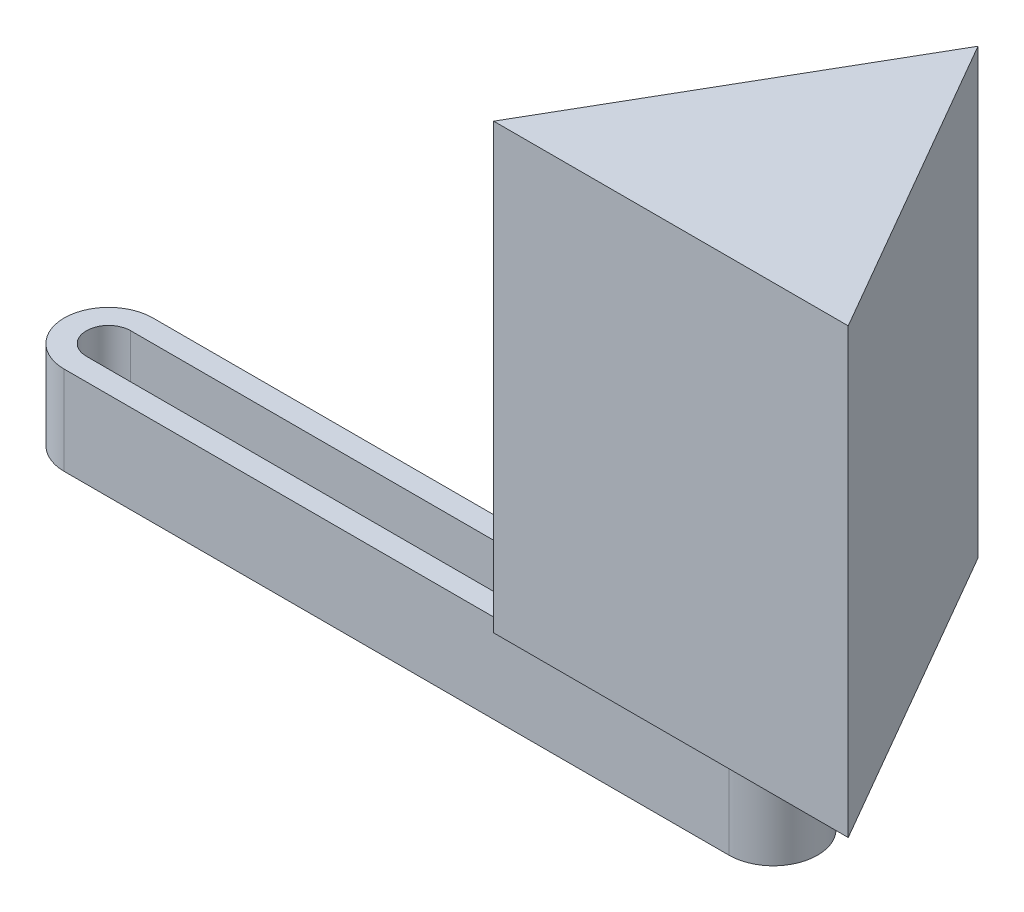
ISO-10303-21;
HEADER;
FILE_DESCRIPTION(('STEP AP214'),'2;1');
FILE_NAME('part.step','',(''),(''),'','','');
FILE_SCHEMA(('AUTOMOTIVE_DESIGN { 1 0 10303 214 1 1 1 1 }'));
ENDSEC;
DATA;
#1=APPLICATION_CONTEXT('core data for automotive mechanical design processes');
#2=APPLICATION_PROTOCOL_DEFINITION('international standard','automotive_design',2000,#1);
#3=PRODUCT_CONTEXT('',#1,'mechanical');
#4=PRODUCT('Part','Part','',(#3));
#5=PRODUCT_RELATED_PRODUCT_CATEGORY('part','',(#4));
#6=PRODUCT_DEFINITION_FORMATION('','',#4);
#7=PRODUCT_DEFINITION_CONTEXT('part definition',#1,'design');
#8=PRODUCT_DEFINITION('design','',#6,#7);
#9=PRODUCT_DEFINITION_SHAPE('','',#8);
#10=(LENGTH_UNIT() NAMED_UNIT(*) SI_UNIT(.MILLI.,.METRE.));
#11=(NAMED_UNIT(*) PLANE_ANGLE_UNIT() SI_UNIT($,.RADIAN.));
#12=(NAMED_UNIT(*) SI_UNIT($,.STERADIAN.) SOLID_ANGLE_UNIT());
#13=UNCERTAINTY_MEASURE_WITH_UNIT(LENGTH_MEASURE(1.E-05),#10,'distance_accuracy_value','');
#14=(GEOMETRIC_REPRESENTATION_CONTEXT(3) GLOBAL_UNCERTAINTY_ASSIGNED_CONTEXT((#13)) GLOBAL_UNIT_ASSIGNED_CONTEXT((#10,
#11,#12)) REPRESENTATION_CONTEXT('',''));
#15=CARTESIAN_POINT('',(0.,0.,0.));
#16=DIRECTION('',(0.,0.,1.));
#17=DIRECTION('',(1.,0.,0.));
#18=AXIS2_PLACEMENT_3D('',#15,#16,#17);
#19=CARTESIAN_POINT('',(410.,-10.,589.615242270663));
#20=DIRECTION('',(0.,1.,0.));
#21=DIRECTION('',(0.,0.,1.));
#22=AXIS2_PLACEMENT_3D('',#19,#20,#21);
#23=CYLINDRICAL_SURFACE('',#22,2.49999999999995);
#24=DIRECTION('',(0.,1.,0.));
#25=VECTOR('',#24,1.);
#26=CARTESIAN_POINT('',(410.,-10.,592.115242270663));
#27=LINE('',#26,#25);
#28=CARTESIAN_POINT('',(410.,-10.,592.115242270663));
#29=VERTEX_POINT('',#28);
#30=CARTESIAN_POINT('',(410.,-5.,592.115242270663));
#31=VERTEX_POINT('',#30);
#32=EDGE_CURVE('E273',#29,#31,#27,.T.);
#33=ORIENTED_EDGE('',*,*,#32,.T.);
#34=CARTESIAN_POINT('',(410.,-5.,589.615242270663));
#35=DIRECTION('',(0.,1.,0.));
#36=DIRECTION('',(0.,0.,1.));
#37=AXIS2_PLACEMENT_3D('',#34,#35,#36);
#38=CIRCLE('',#37,2.49999999999995);
#39=CARTESIAN_POINT('',(410.,-5.,587.115242270663));
#40=VERTEX_POINT('',#39);
#41=EDGE_CURVE('E211',#40,#31,#38,.F.);
#42=ORIENTED_EDGE('',*,*,#41,.F.);
#43=DIRECTION('',(0.,1.,0.));
#44=VECTOR('',#43,1.);
#45=CARTESIAN_POINT('',(410.,-10.,587.115242270663));
#46=LINE('',#45,#44);
#47=CARTESIAN_POINT('',(410.,-10.,587.115242270663));
#48=VERTEX_POINT('',#47);
#49=EDGE_CURVE('E274',#48,#40,#46,.T.);
#50=ORIENTED_EDGE('',*,*,#49,.F.);
#51=CARTESIAN_POINT('',(410.,-10.,589.615242270663));
#52=DIRECTION('',(0.,1.,0.));
#53=DIRECTION('',(0.,0.,1.));
#54=AXIS2_PLACEMENT_3D('',#51,#52,#53);
#55=CIRCLE('',#54,2.49999999999995);
#56=EDGE_CURVE('E231',#48,#29,#55,.F.);
#57=ORIENTED_EDGE('',*,*,#56,.T.);
#58=EDGE_LOOP('',(#33,#42,#50,#57));
#59=FACE_BOUND('',#58,.T.);
#60=ADVANCED_FACE('F35',(#59),#23,.F.);
#61=CARTESIAN_POINT('',(0.,-10.,584.615242270663));
#62=DIRECTION('',(0.,0.,-1.));
#63=DIRECTION('',(-1.,0.,0.));
#64=AXIS2_PLACEMENT_3D('',#61,#62,#63);
#65=PLANE('',#64);
#66=DIRECTION('',(-1.,0.,0.));
#67=VECTOR('',#66,1.);
#68=CARTESIAN_POINT('',(0.,0.,584.615242270663));
#69=LINE('',#68,#67);
#70=CARTESIAN_POINT('',(410.,0.,584.615242270663));
#71=VERTEX_POINT('',#70);
#72=CARTESIAN_POINT('',(335.,0.,584.615242270663));
#73=VERTEX_POINT('',#72);
#74=EDGE_CURVE('E253',#71,#73,#69,.T.);
#75=ORIENTED_EDGE('',*,*,#74,.F.);
#76=DIRECTION('',(0.,1.,0.));
#77=VECTOR('',#76,1.);
#78=CARTESIAN_POINT('',(410.,-10.,584.615242270663));
#79=LINE('',#78,#77);
#80=CARTESIAN_POINT('',(410.,-10.,584.615242270663));
#81=VERTEX_POINT('',#80);
#82=EDGE_CURVE('E11',#81,#71,#79,.T.);
#83=ORIENTED_EDGE('',*,*,#82,.F.);
#84=DIRECTION('',(-1.,0.,0.));
#85=VECTOR('',#84,1.);
#86=CARTESIAN_POINT('',(0.,-10.,584.615242270663));
#87=LINE('',#86,#85);
#88=CARTESIAN_POINT('',(335.,-10.,584.615242270663));
#89=VERTEX_POINT('',#88);
#90=EDGE_CURVE('E236',#81,#89,#87,.T.);
#91=ORIENTED_EDGE('',*,*,#90,.T.);
#92=DIRECTION('',(0.,1.,0.));
#93=VECTOR('',#92,1.);
#94=CARTESIAN_POINT('',(335.,-10.,584.615242270663));
#95=LINE('',#94,#93);
#96=EDGE_CURVE('E268',#89,#73,#95,.T.);
#97=ORIENTED_EDGE('',*,*,#96,.T.);
#98=EDGE_LOOP('',(#75,#83,#91,#97));
#99=FACE_BOUND('',#98,.T.);
#100=ADVANCED_FACE('F310',(#99),#65,.T.);
#101=CARTESIAN_POINT('',(410.,-10.,589.615242270663));
#102=DIRECTION('',(0.,1.,0.));
#103=DIRECTION('',(0.,0.,1.));
#104=AXIS2_PLACEMENT_3D('',#101,#102,#103);
#105=CYLINDRICAL_SURFACE('',#104,5.);
#106=CARTESIAN_POINT('',(410.,0.,589.615242270663));
#107=DIRECTION('',(0.,1.,0.));
#108=DIRECTION('',(0.,0.,1.));
#109=AXIS2_PLACEMENT_3D('',#106,#107,#108);
#110=CIRCLE('',#109,5.);
#111=CARTESIAN_POINT('',(410.,0.,594.615242270663));
#112=VERTEX_POINT('',#111);
#113=EDGE_CURVE('E229',#71,#112,#110,.F.);
#114=ORIENTED_EDGE('',*,*,#113,.T.);
#115=DIRECTION('',(0.,1.,0.));
#116=VECTOR('',#115,1.);
#117=CARTESIAN_POINT('',(410.,-10.,594.615242270663));
#118=LINE('',#117,#116);
#119=CARTESIAN_POINT('',(410.,-10.,594.615242270663));
#120=VERTEX_POINT('',#119);
#121=EDGE_CURVE('E44',#120,#112,#118,.T.);
#122=ORIENTED_EDGE('',*,*,#121,.F.);
#123=CARTESIAN_POINT('',(410.,-10.,589.615242270663));
#124=DIRECTION('',(0.,1.,0.));
#125=DIRECTION('',(0.,0.,1.));
#126=AXIS2_PLACEMENT_3D('',#123,#124,#125);
#127=CIRCLE('',#126,5.);
#128=EDGE_CURVE('E244',#81,#120,#127,.F.);
#129=ORIENTED_EDGE('',*,*,#128,.F.);
#130=ORIENTED_EDGE('',*,*,#82,.T.);
#131=EDGE_LOOP('',(#114,#122,#129,#130));
#132=FACE_BOUND('',#131,.T.);
#133=ADVANCED_FACE('F315',(#132),#105,.T.);
#134=CARTESIAN_POINT('',(0.,-10.,594.615242270663));
#135=DIRECTION('',(0.,0.,-1.));
#136=DIRECTION('',(-1.,0.,0.));
#137=AXIS2_PLACEMENT_3D('',#134,#135,#136);
#138=PLANE('',#137);
#139=DIRECTION('',(-1.,0.,0.));
#140=VECTOR('',#139,1.);
#141=CARTESIAN_POINT('',(0.,0.,594.615242270663));
#142=LINE('',#141,#140);
#143=CARTESIAN_POINT('',(335.,0.,594.615242270663));
#144=VERTEX_POINT('',#143);
#145=EDGE_CURVE('E259',#112,#144,#142,.T.);
#146=ORIENTED_EDGE('',*,*,#145,.T.);
#147=DIRECTION('',(0.,1.,0.));
#148=VECTOR('',#147,1.);
#149=CARTESIAN_POINT('',(335.,-10.,594.615242270663));
#150=LINE('',#149,#148);
#151=CARTESIAN_POINT('',(335.,-10.,594.615242270663));
#152=VERTEX_POINT('',#151);
#153=EDGE_CURVE('E266',#152,#144,#150,.T.);
#154=ORIENTED_EDGE('',*,*,#153,.F.);
#155=DIRECTION('',(-1.,0.,0.));
#156=VECTOR('',#155,1.);
#157=CARTESIAN_POINT('',(0.,-10.,594.615242270663));
#158=LINE('',#157,#156);
#159=EDGE_CURVE('E242',#120,#152,#158,.T.);
#160=ORIENTED_EDGE('',*,*,#159,.F.);
#161=ORIENTED_EDGE('',*,*,#121,.T.);
#162=EDGE_LOOP('',(#146,#154,#160,#161));
#163=FACE_BOUND('',#162,.T.);
#164=ADVANCED_FACE('F319',(#163),#138,.F.);
#165=CARTESIAN_POINT('',(335.,-10.,589.615242270663));
#166=DIRECTION('',(0.,1.,0.));
#167=DIRECTION('',(0.,0.,1.));
#168=AXIS2_PLACEMENT_3D('',#165,#166,#167);
#169=CYLINDRICAL_SURFACE('',#168,2.49999999999995);
#170=CARTESIAN_POINT('',(335.,0.,589.615242270663));
#171=DIRECTION('',(0.,1.,0.));
#172=DIRECTION('',(0.,0.,1.));
#173=AXIS2_PLACEMENT_3D('',#170,#171,#172);
#174=CIRCLE('',#173,2.49999999999995);
#175=CARTESIAN_POINT('',(335.,0.,587.115242270663));
#176=VERTEX_POINT('',#175);
#177=CARTESIAN_POINT('',(335.,0.,592.115242270663));
#178=VERTEX_POINT('',#177);
#179=EDGE_CURVE('E222',#176,#178,#174,.T.);
#180=ORIENTED_EDGE('',*,*,#179,.T.);
#181=DIRECTION('',(0.,1.,0.));
#182=VECTOR('',#181,1.);
#183=CARTESIAN_POINT('',(335.,-10.,592.115242270663));
#184=LINE('',#183,#182);
#185=CARTESIAN_POINT('',(335.,-10.,592.115242270663));
#186=VERTEX_POINT('',#185);
#187=EDGE_CURVE('E270',#186,#178,#184,.T.);
#188=ORIENTED_EDGE('',*,*,#187,.F.);
#189=CARTESIAN_POINT('',(335.,-10.,589.615242270663));
#190=DIRECTION('',(0.,1.,0.));
#191=DIRECTION('',(0.,0.,1.));
#192=AXIS2_PLACEMENT_3D('',#189,#190,#191);
#193=CIRCLE('',#192,2.49999999999995);
#194=CARTESIAN_POINT('',(335.,-10.,587.115242270663));
#195=VERTEX_POINT('',#194);
#196=EDGE_CURVE('E225',#195,#186,#193,.T.);
#197=ORIENTED_EDGE('',*,*,#196,.F.);
#198=DIRECTION('',(0.,1.,0.));
#199=VECTOR('',#198,1.);
#200=CARTESIAN_POINT('',(335.,-10.,587.115242270663));
#201=LINE('',#200,#199);
#202=EDGE_CURVE('E39',#195,#176,#201,.T.);
#203=ORIENTED_EDGE('',*,*,#202,.T.);
#204=EDGE_LOOP('',(#180,#188,#197,#203));
#205=FACE_BOUND('',#204,.T.);
#206=ADVANCED_FACE('F37',(#205),#169,.F.);
#207=CARTESIAN_POINT('',(0.,-10.,592.115242270663));
#208=DIRECTION('',(0.,0.,1.));
#209=DIRECTION('',(1.,0.,0.));
#210=AXIS2_PLACEMENT_3D('',#207,#208,#209);
#211=PLANE('',#210);
#212=DIRECTION('',(1.,0.,0.));
#213=VECTOR('',#212,1.);
#214=CARTESIAN_POINT('',(0.,0.,592.115242270663));
#215=LINE('',#214,#213);
#216=CARTESIAN_POINT('',(407.5,0.,592.115242270663));
#217=VERTEX_POINT('',#216);
#218=EDGE_CURVE('E251',#178,#217,#215,.T.);
#219=ORIENTED_EDGE('',*,*,#218,.T.);
#220=DIRECTION('',(0.,1.,0.));
#221=VECTOR('',#220,1.);
#222=CARTESIAN_POINT('',(407.5,-5.,592.115242270663));
#223=LINE('',#222,#221);
#224=CARTESIAN_POINT('',(407.5,-5.,592.115242270663));
#225=VERTEX_POINT('',#224);
#226=EDGE_CURVE('E52',#225,#217,#223,.T.);
#227=ORIENTED_EDGE('',*,*,#226,.F.);
#228=DIRECTION('',(-1.,0.,0.));
#229=VECTOR('',#228,1.);
#230=CARTESIAN_POINT('',(0.,-5.,592.115242270663));
#231=LINE('',#230,#229);
#232=EDGE_CURVE('E56',#31,#225,#231,.T.);
#233=ORIENTED_EDGE('',*,*,#232,.F.);
#234=ORIENTED_EDGE('',*,*,#32,.F.);
#235=DIRECTION('',(1.,0.,0.));
#236=VECTOR('',#235,1.);
#237=CARTESIAN_POINT('',(0.,-10.,592.115242270663));
#238=LINE('',#237,#236);
#239=EDGE_CURVE('E234',#186,#29,#238,.T.);
#240=ORIENTED_EDGE('',*,*,#239,.F.);
#241=ORIENTED_EDGE('',*,*,#187,.T.);
#242=EDGE_LOOP('',(#219,#227,#233,#234,#240,#241));
#243=FACE_BOUND('',#242,.T.);
#244=ADVANCED_FACE('F292',(#243),#211,.F.);
#245=CARTESIAN_POINT('',(0.,-10.,587.115242270663));
#246=DIRECTION('',(0.,0.,-1.));
#247=DIRECTION('',(-1.,0.,0.));
#248=AXIS2_PLACEMENT_3D('',#245,#246,#247);
#249=PLANE('',#248);
#250=DIRECTION('',(-1.,0.,0.));
#251=VECTOR('',#250,1.);
#252=CARTESIAN_POINT('',(0.,-5.,587.115242270663));
#253=LINE('',#252,#251);
#254=CARTESIAN_POINT('',(407.5,-5.,587.115242270663));
#255=VERTEX_POINT('',#254);
#256=EDGE_CURVE('E214',#40,#255,#253,.T.);
#257=ORIENTED_EDGE('',*,*,#256,.T.);
#258=DIRECTION('',(0.,1.,0.));
#259=VECTOR('',#258,1.);
#260=CARTESIAN_POINT('',(407.5,-5.,587.115242270663));
#261=LINE('',#260,#259);
#262=CARTESIAN_POINT('',(407.5,0.,587.115242270663));
#263=VERTEX_POINT('',#262);
#264=EDGE_CURVE('E220',#255,#263,#261,.T.);
#265=ORIENTED_EDGE('',*,*,#264,.T.);
#266=DIRECTION('',(-1.,0.,0.));
#267=VECTOR('',#266,1.);
#268=CARTESIAN_POINT('',(0.,0.,587.115242270663));
#269=LINE('',#268,#267);
#270=EDGE_CURVE('E249',#263,#176,#269,.T.);
#271=ORIENTED_EDGE('',*,*,#270,.T.);
#272=ORIENTED_EDGE('',*,*,#202,.F.);
#273=DIRECTION('',(-1.,0.,0.));
#274=VECTOR('',#273,1.);
#275=CARTESIAN_POINT('',(0.,-10.,587.115242270663));
#276=LINE('',#275,#274);
#277=EDGE_CURVE('E228',#48,#195,#276,.T.);
#278=ORIENTED_EDGE('',*,*,#277,.F.);
#279=ORIENTED_EDGE('',*,*,#49,.T.);
#280=EDGE_LOOP('',(#257,#265,#271,#272,#278,#279));
#281=FACE_BOUND('',#280,.T.);
#282=ADVANCED_FACE('F297',(#281),#249,.F.);
#283=CARTESIAN_POINT('',(335.,-10.,589.615242270663));
#284=DIRECTION('',(0.,1.,0.));
#285=DIRECTION('',(0.,0.,1.));
#286=AXIS2_PLACEMENT_3D('',#283,#284,#285);
#287=CYLINDRICAL_SURFACE('',#286,5.);
#288=CARTESIAN_POINT('',(335.,0.,589.615242270663));
#289=DIRECTION('',(0.,1.,0.));
#290=DIRECTION('',(0.,0.,1.));
#291=AXIS2_PLACEMENT_3D('',#288,#289,#290);
#292=CIRCLE('',#291,5.);
#293=EDGE_CURVE('E256',#73,#144,#292,.T.);
#294=ORIENTED_EDGE('',*,*,#293,.F.);
#295=ORIENTED_EDGE('',*,*,#96,.F.);
#296=CARTESIAN_POINT('',(335.,-10.,589.615242270663));
#297=DIRECTION('',(0.,1.,0.));
#298=DIRECTION('',(0.,0.,1.));
#299=AXIS2_PLACEMENT_3D('',#296,#297,#298);
#300=CIRCLE('',#299,5.);
#301=EDGE_CURVE('E239',#89,#152,#300,.T.);
#302=ORIENTED_EDGE('',*,*,#301,.T.);
#303=ORIENTED_EDGE('',*,*,#153,.T.);
#304=EDGE_LOOP('',(#294,#295,#302,#303));
#305=FACE_BOUND('',#304,.T.);
#306=ADVANCED_FACE('F300',(#305),#287,.T.);
#307=CARTESIAN_POINT('',(0.,-10.,0.));
#308=DIRECTION('',(0.,1.,0.));
#309=DIRECTION('',(0.,0.,1.));
#310=AXIS2_PLACEMENT_3D('',#307,#308,#309);
#311=PLANE('',#310);
#312=ORIENTED_EDGE('',*,*,#196,.T.);
#313=ORIENTED_EDGE('',*,*,#239,.T.);
#314=ORIENTED_EDGE('',*,*,#56,.F.);
#315=ORIENTED_EDGE('',*,*,#277,.T.);
#316=EDGE_LOOP('',(#312,#313,#314,#315));
#317=FACE_BOUND('',#316,.T.);
#318=ORIENTED_EDGE('',*,*,#90,.F.);
#319=ORIENTED_EDGE('',*,*,#128,.T.);
#320=ORIENTED_EDGE('',*,*,#159,.T.);
#321=ORIENTED_EDGE('',*,*,#301,.F.);
#322=EDGE_LOOP('',(#318,#319,#320,#321));
#323=FACE_BOUND('',#322,.T.);
#324=ADVANCED_FACE('F295',(#317,#323),#311,.F.);
#325=CARTESIAN_POINT('',(0.,0.,0.));
#326=DIRECTION('',(0.,1.,0.));
#327=DIRECTION('',(0.,0.,1.));
#328=AXIS2_PLACEMENT_3D('',#325,#326,#327);
#329=PLANE('',#328);
#330=DIRECTION('',(-1.,0.,0.));
#331=VECTOR('',#330,1.);
#332=CARTESIAN_POINT('',(0.,0.,587.115242270663));
#333=LINE('',#332,#331);
#334=CARTESIAN_POINT('',(412.5,0.,587.115242270663));
#335=VERTEX_POINT('',#334);
#336=EDGE_CURVE('E181',#335,#263,#333,.T.);
#337=ORIENTED_EDGE('',*,*,#336,.F.);
#338=DIRECTION('',(0.,0.,-1.));
#339=VECTOR('',#338,1.);
#340=CARTESIAN_POINT('',(412.5,0.,0.));
#341=LINE('',#340,#339);
#342=CARTESIAN_POINT('',(412.5,0.,592.115242270663));
#343=VERTEX_POINT('',#342);
#344=EDGE_CURVE('E187',#343,#335,#341,.T.);
#345=ORIENTED_EDGE('',*,*,#344,.F.);
#346=DIRECTION('',(-1.,0.,0.));
#347=VECTOR('',#346,1.);
#348=CARTESIAN_POINT('',(0.,0.,592.115242270663));
#349=LINE('',#348,#347);
#350=EDGE_CURVE('E199',#343,#217,#349,.T.);
#351=ORIENTED_EDGE('',*,*,#350,.T.);
#352=ORIENTED_EDGE('',*,*,#218,.F.);
#353=ORIENTED_EDGE('',*,*,#179,.F.);
#354=ORIENTED_EDGE('',*,*,#270,.F.);
#355=EDGE_LOOP('',(#337,#345,#351,#352,#353,#354));
#356=FACE_BOUND('',#355,.T.);
#357=ORIENTED_EDGE('',*,*,#74,.T.);
#358=ORIENTED_EDGE('',*,*,#293,.T.);
#359=ORIENTED_EDGE('',*,*,#145,.F.);
#360=ORIENTED_EDGE('',*,*,#113,.F.);
#361=EDGE_LOOP('',(#357,#358,#359,#360));
#362=FACE_BOUND('',#361,.T.);
#363=ADVANCED_FACE('F288',(#356,#362),#329,.T.);
#364=CARTESIAN_POINT('',(407.5,-5.,0.));
#365=DIRECTION('',(-1.,0.,0.));
#366=DIRECTION('',(0.,0.,1.));
#367=AXIS2_PLACEMENT_3D('',#364,#365,#366);
#368=PLANE('',#367);
#369=ORIENTED_EDGE('',*,*,#226,.T.);
#370=DIRECTION('',(0.,-1.,0.));
#371=VECTOR('',#370,1.);
#372=CARTESIAN_POINT('',(407.5,5.,592.115242270663));
#373=LINE('',#372,#371);
#374=CARTESIAN_POINT('',(407.5,5.,592.115242270663));
#375=VERTEX_POINT('',#374);
#376=EDGE_CURVE('E207',#375,#217,#373,.T.);
#377=ORIENTED_EDGE('',*,*,#376,.F.);
#378=DIRECTION('',(0.,0.,1.));
#379=VECTOR('',#378,1.);
#380=CARTESIAN_POINT('',(407.5,5.,0.));
#381=LINE('',#380,#379);
#382=CARTESIAN_POINT('',(407.5,5.,587.115242270663));
#383=VERTEX_POINT('',#382);
#384=EDGE_CURVE('E186',#383,#375,#381,.T.);
#385=ORIENTED_EDGE('',*,*,#384,.F.);
#386=DIRECTION('',(0.,-1.,0.));
#387=VECTOR('',#386,1.);
#388=CARTESIAN_POINT('',(407.5,5.,587.115242270663));
#389=LINE('',#388,#387);
#390=EDGE_CURVE('E209',#383,#263,#389,.T.);
#391=ORIENTED_EDGE('',*,*,#390,.T.);
#392=ORIENTED_EDGE('',*,*,#264,.F.);
#393=DIRECTION('',(0.,0.,1.));
#394=VECTOR('',#393,1.);
#395=CARTESIAN_POINT('',(407.5,-5.,0.));
#396=LINE('',#395,#394);
#397=EDGE_CURVE('E216',#255,#225,#396,.T.);
#398=ORIENTED_EDGE('',*,*,#397,.T.);
#399=EDGE_LOOP('',(#369,#377,#385,#391,#392,#398));
#400=FACE_BOUND('',#399,.T.);
#401=ADVANCED_FACE('F328',(#400),#368,.T.);
#402=CARTESIAN_POINT('',(0.,-5.,0.));
#403=DIRECTION('',(0.,1.,0.));
#404=DIRECTION('',(0.,0.,1.));
#405=AXIS2_PLACEMENT_3D('',#402,#403,#404);
#406=PLANE('',#405);
#407=ORIENTED_EDGE('',*,*,#41,.T.);
#408=ORIENTED_EDGE('',*,*,#232,.T.);
#409=ORIENTED_EDGE('',*,*,#397,.F.);
#410=ORIENTED_EDGE('',*,*,#256,.F.);
#411=EDGE_LOOP('',(#407,#408,#409,#410));
#412=FACE_BOUND('',#411,.T.);
#413=ADVANCED_FACE('F333',(#412),#406,.F.);
#414=CARTESIAN_POINT('',(0.,5.,587.115242270663));
#415=DIRECTION('',(0.,0.,1.));
#416=DIRECTION('',(1.,0.,0.));
#417=AXIS2_PLACEMENT_3D('',#414,#415,#416);
#418=PLANE('',#417);
#419=ORIENTED_EDGE('',*,*,#336,.T.);
#420=ORIENTED_EDGE('',*,*,#390,.F.);
#421=DIRECTION('',(-1.,0.,0.));
#422=VECTOR('',#421,1.);
#423=CARTESIAN_POINT('',(0.,5.,587.115242270663));
#424=LINE('',#423,#422);
#425=CARTESIAN_POINT('',(412.5,5.,587.115242270663));
#426=VERTEX_POINT('',#425);
#427=EDGE_CURVE('E183',#426,#383,#424,.T.);
#428=ORIENTED_EDGE('',*,*,#427,.F.);
#429=DIRECTION('',(0.,-1.,0.));
#430=VECTOR('',#429,1.);
#431=CARTESIAN_POINT('',(412.5,5.,587.115242270663));
#432=LINE('',#431,#430);
#433=EDGE_CURVE('E196',#426,#335,#432,.T.);
#434=ORIENTED_EDGE('',*,*,#433,.T.);
#435=EDGE_LOOP('',(#419,#420,#428,#434));
#436=FACE_BOUND('',#435,.T.);
#437=ADVANCED_FACE('F337',(#436),#418,.F.);
#438=CARTESIAN_POINT('',(0.,5.,592.115242270663));
#439=DIRECTION('',(0.,0.,1.));
#440=DIRECTION('',(1.,0.,0.));
#441=AXIS2_PLACEMENT_3D('',#438,#439,#440);
#442=PLANE('',#441);
#443=ORIENTED_EDGE('',*,*,#350,.F.);
#444=DIRECTION('',(0.,-1.,0.));
#445=VECTOR('',#444,1.);
#446=CARTESIAN_POINT('',(412.5,5.,592.115242270663));
#447=LINE('',#446,#445);
#448=CARTESIAN_POINT('',(412.5,5.,592.115242270663));
#449=VERTEX_POINT('',#448);
#450=EDGE_CURVE('E205',#449,#343,#447,.T.);
#451=ORIENTED_EDGE('',*,*,#450,.F.);
#452=DIRECTION('',(-1.,0.,0.));
#453=VECTOR('',#452,1.);
#454=CARTESIAN_POINT('',(0.,5.,592.115242270663));
#455=LINE('',#454,#453);
#456=EDGE_CURVE('E190',#449,#375,#455,.T.);
#457=ORIENTED_EDGE('',*,*,#456,.T.);
#458=ORIENTED_EDGE('',*,*,#376,.T.);
#459=EDGE_LOOP('',(#443,#451,#457,#458));
#460=FACE_BOUND('',#459,.T.);
#461=ADVANCED_FACE('F341',(#460),#442,.T.);
#462=CARTESIAN_POINT('',(412.5,5.,0.));
#463=DIRECTION('',(-1.,0.,0.));
#464=DIRECTION('',(0.,0.,1.));
#465=AXIS2_PLACEMENT_3D('',#462,#463,#464);
#466=PLANE('',#465);
#467=ORIENTED_EDGE('',*,*,#344,.T.);
#468=ORIENTED_EDGE('',*,*,#433,.F.);
#469=DIRECTION('',(0.,0.,-1.));
#470=VECTOR('',#469,1.);
#471=CARTESIAN_POINT('',(412.5,5.,0.));
#472=LINE('',#471,#470);
#473=EDGE_CURVE('E193',#449,#426,#472,.T.);
#474=ORIENTED_EDGE('',*,*,#473,.F.);
#475=ORIENTED_EDGE('',*,*,#450,.T.);
#476=EDGE_LOOP('',(#467,#468,#474,#475));
#477=FACE_BOUND('',#476,.T.);
#478=ADVANCED_FACE('F345',(#477),#466,.F.);
#479=CARTESIAN_POINT('',(62.1891108675465,55.,-35.9048999000412));
#480=DIRECTION('',(0.86602540378444,0.,-0.499999999999998));
#481=DIRECTION('',(-0.499999999999998,0.,-0.86602540378444));
#482=AXIS2_PLACEMENT_3D('',#479,#480,#481);
#483=PLANE('',#482);
#484=DIRECTION('',(0.499999999999998,0.,0.86602540378444));
#485=VECTOR('',#484,1.);
#486=CARTESIAN_POINT('',(62.1891108675465,5.,-35.9048999000412));
#487=LINE('',#486,#485);
#488=CARTESIAN_POINT('',(410.,5.,566.521231503078));
#489=VERTEX_POINT('',#488);
#490=CARTESIAN_POINT('',(430.,5.,601.162247654456));
#491=VERTEX_POINT('',#490);
#492=EDGE_CURVE('E177',#489,#491,#487,.T.);
#493=ORIENTED_EDGE('',*,*,#492,.F.);
#494=DIRECTION('',(0.,-1.,0.));
#495=VECTOR('',#494,1.);
#496=CARTESIAN_POINT('',(410.,55.,566.521231503078));
#497=LINE('',#496,#495);
#498=CARTESIAN_POINT('',(410.,55.,566.521231503078));
#499=VERTEX_POINT('',#498);
#500=EDGE_CURVE('E170',#499,#489,#497,.T.);
#501=ORIENTED_EDGE('',*,*,#500,.F.);
#502=DIRECTION('',(0.499999999999998,0.,0.86602540378444));
#503=VECTOR('',#502,1.);
#504=CARTESIAN_POINT('',(62.1891108675465,55.,-35.9048999000412));
#505=LINE('',#504,#503);
#506=CARTESIAN_POINT('',(430.,55.,601.162247654456));
#507=VERTEX_POINT('',#506);
#508=EDGE_CURVE('E166',#499,#507,#505,.T.);
#509=ORIENTED_EDGE('',*,*,#508,.T.);
#510=DIRECTION('',(0.,-1.,0.));
#511=VECTOR('',#510,1.);
#512=CARTESIAN_POINT('',(430.,55.,601.162247654456));
#513=LINE('',#512,#511);
#514=EDGE_CURVE('E149',#507,#491,#513,.T.);
#515=ORIENTED_EDGE('',*,*,#514,.T.);
#516=EDGE_LOOP('',(#493,#501,#509,#515));
#517=FACE_BOUND('',#516,.T.);
#518=ADVANCED_FACE('F169',(#517),#483,.T.);
#519=CARTESIAN_POINT('',(552.810889132455,55.,319.165515651578));
#520=DIRECTION('',(-0.866025403784439,0.,-0.499999999999999));
#521=DIRECTION('',(-0.499999999999999,0.,0.866025403784439));
#522=AXIS2_PLACEMENT_3D('',#519,#520,#521);
#523=PLANE('',#522);
#524=DIRECTION('',(0.499999999999999,0.,-0.866025403784439));
#525=VECTOR('',#524,1.);
#526=CARTESIAN_POINT('',(552.810889132455,5.,319.165515651578));
#527=LINE('',#526,#525);
#528=CARTESIAN_POINT('',(390.,5.,601.162247654456));
#529=VERTEX_POINT('',#528);
#530=EDGE_CURVE('E171',#529,#489,#527,.T.);
#531=ORIENTED_EDGE('',*,*,#530,.F.);
#532=DIRECTION('',(0.,-1.,0.));
#533=VECTOR('',#532,1.);
#534=CARTESIAN_POINT('',(390.,55.,601.162247654456));
#535=LINE('',#534,#533);
#536=CARTESIAN_POINT('',(390.,55.,601.162247654456));
#537=VERTEX_POINT('',#536);
#538=EDGE_CURVE('E160',#537,#529,#535,.T.);
#539=ORIENTED_EDGE('',*,*,#538,.F.);
#540=DIRECTION('',(0.499999999999999,0.,-0.866025403784439));
#541=VECTOR('',#540,1.);
#542=CARTESIAN_POINT('',(552.810889132455,55.,319.165515651578));
#543=LINE('',#542,#541);
#544=EDGE_CURVE('E161',#537,#499,#543,.T.);
#545=ORIENTED_EDGE('',*,*,#544,.T.);
#546=ORIENTED_EDGE('',*,*,#500,.T.);
#547=EDGE_LOOP('',(#531,#539,#545,#546));
#548=FACE_BOUND('',#547,.T.);
#549=ADVANCED_FACE('F352',(#548),#523,.T.);
#550=CARTESIAN_POINT('',(0.,55.,601.162247654456));
#551=DIRECTION('',(0.,0.,1.));
#552=DIRECTION('',(1.,0.,0.));
#553=AXIS2_PLACEMENT_3D('',#550,#551,#552);
#554=PLANE('',#553);
#555=DIRECTION('',(-1.,0.,0.));
#556=VECTOR('',#555,1.);
#557=CARTESIAN_POINT('',(0.,5.,601.162247654456));
#558=LINE('',#557,#556);
#559=EDGE_CURVE('E155',#491,#529,#558,.T.);
#560=ORIENTED_EDGE('',*,*,#559,.F.);
#561=ORIENTED_EDGE('',*,*,#514,.F.);
#562=DIRECTION('',(-1.,0.,0.));
#563=VECTOR('',#562,1.);
#564=CARTESIAN_POINT('',(0.,55.,601.162247654456));
#565=LINE('',#564,#563);
#566=EDGE_CURVE('E152',#507,#537,#565,.T.);
#567=ORIENTED_EDGE('',*,*,#566,.T.);
#568=ORIENTED_EDGE('',*,*,#538,.T.);
#569=EDGE_LOOP('',(#560,#561,#567,#568));
#570=FACE_BOUND('',#569,.T.);
#571=ADVANCED_FACE('F151',(#570),#554,.T.);
#572=CARTESIAN_POINT('',(0.,55.,0.));
#573=DIRECTION('',(0.,-1.,0.));
#574=DIRECTION('',(0.,0.,-1.));
#575=AXIS2_PLACEMENT_3D('',#572,#573,#574);
#576=PLANE('',#575);
#577=ORIENTED_EDGE('',*,*,#508,.F.);
#578=ORIENTED_EDGE('',*,*,#544,.F.);
#579=ORIENTED_EDGE('',*,*,#566,.F.);
#580=EDGE_LOOP('',(#577,#578,#579));
#581=FACE_BOUND('',#580,.T.);
#582=ADVANCED_FACE('F165',(#581),#576,.F.);
#583=CARTESIAN_POINT('',(0.,5.,0.));
#584=DIRECTION('',(0.,-1.,0.));
#585=DIRECTION('',(0.,0.,-1.));
#586=AXIS2_PLACEMENT_3D('',#583,#584,#585);
#587=PLANE('',#586);
#588=ORIENTED_EDGE('',*,*,#473,.T.);
#589=ORIENTED_EDGE('',*,*,#427,.T.);
#590=ORIENTED_EDGE('',*,*,#384,.T.);
#591=ORIENTED_EDGE('',*,*,#456,.F.);
#592=EDGE_LOOP('',(#588,#589,#590,#591));
#593=FACE_BOUND('',#592,.T.);
#594=ORIENTED_EDGE('',*,*,#492,.T.);
#595=ORIENTED_EDGE('',*,*,#559,.T.);
#596=ORIENTED_EDGE('',*,*,#530,.T.);
#597=EDGE_LOOP('',(#594,#595,#596));
#598=FACE_BOUND('',#597,.T.);
#599=ADVANCED_FACE('F358',(#593,#598),#587,.T.);
#600=CLOSED_SHELL('',(#60,#100,#133,#164,#206,#244,#282,#306,#324,#363,#401,#413,#437,#461,#478,
#518,#549,#571,#582,#599));
#601=MANIFOLD_SOLID_BREP('B2',#600);
#602=ADVANCED_BREP_SHAPE_REPRESENTATION('',(#18,#601),#14);
#603=SHAPE_DEFINITION_REPRESENTATION(#9,#602);
ENDSEC;
END-ISO-10303-21;
